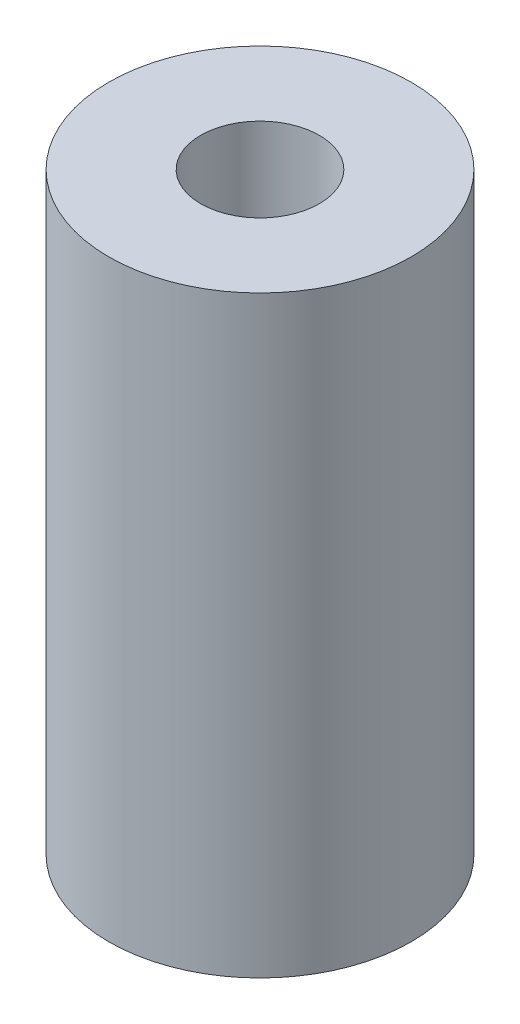
ISO-10303-21;
HEADER;
FILE_DESCRIPTION(('STEP AP214'),'2;1');
FILE_NAME('part.step','',(''),(''),'','','');
FILE_SCHEMA(('AUTOMOTIVE_DESIGN { 1 0 10303 214 1 1 1 1 }'));
ENDSEC;
DATA;
#1=APPLICATION_CONTEXT('core data for automotive mechanical design processes');
#2=APPLICATION_PROTOCOL_DEFINITION('international standard','automotive_design',2000,#1);
#3=PRODUCT_CONTEXT('',#1,'mechanical');
#4=PRODUCT('Part','Part','',(#3));
#5=PRODUCT_RELATED_PRODUCT_CATEGORY('part','',(#4));
#6=PRODUCT_DEFINITION_FORMATION('','',#4);
#7=PRODUCT_DEFINITION_CONTEXT('part definition',#1,'design');
#8=PRODUCT_DEFINITION('design','',#6,#7);
#9=PRODUCT_DEFINITION_SHAPE('','',#8);
#10=(LENGTH_UNIT() NAMED_UNIT(*) SI_UNIT(.MILLI.,.METRE.));
#11=(NAMED_UNIT(*) PLANE_ANGLE_UNIT() SI_UNIT($,.RADIAN.));
#12=(NAMED_UNIT(*) SI_UNIT($,.STERADIAN.) SOLID_ANGLE_UNIT());
#13=UNCERTAINTY_MEASURE_WITH_UNIT(LENGTH_MEASURE(1.E-05),#10,'distance_accuracy_value','');
#14=(GEOMETRIC_REPRESENTATION_CONTEXT(3) GLOBAL_UNCERTAINTY_ASSIGNED_CONTEXT((#13)) GLOBAL_UNIT_ASSIGNED_CONTEXT((#10,
#11,#12)) REPRESENTATION_CONTEXT('',''));
#15=CARTESIAN_POINT('',(0.,0.,0.));
#16=DIRECTION('',(0.,0.,1.));
#17=DIRECTION('',(1.,0.,0.));
#18=AXIS2_PLACEMENT_3D('',#15,#16,#17);
#19=CARTESIAN_POINT('',(0.,100.,0.));
#20=DIRECTION('',(0.,1.,0.));
#21=DIRECTION('',(0.,0.,1.));
#22=AXIS2_PLACEMENT_3D('',#19,#20,#21);
#23=PLANE('',#22);
#24=CARTESIAN_POINT('',(0.,100.,0.));
#25=DIRECTION('',(0.,1.,0.));
#26=DIRECTION('',(0.,0.,1.));
#27=AXIS2_PLACEMENT_3D('',#24,#25,#26);
#28=CIRCLE('',#27,25.5);
#29=CARTESIAN_POINT('',(0.,100.,25.5));
#30=VERTEX_POINT('',#29);
#31=EDGE_CURVE('E10',#30,#30,#28,.T.);
#32=ORIENTED_EDGE('',*,*,#31,.T.);
#33=EDGE_LOOP('',(#32));
#34=FACE_BOUND('',#33,.T.);
#35=CARTESIAN_POINT('',(0.,100.,0.));
#36=DIRECTION('',(0.,1.,0.));
#37=DIRECTION('',(0.,0.,1.));
#38=AXIS2_PLACEMENT_3D('',#35,#36,#37);
#39=CIRCLE('',#38,10.);
#40=CARTESIAN_POINT('',(0.,100.,10.));
#41=VERTEX_POINT('',#40);
#42=EDGE_CURVE('E42',#41,#41,#39,.T.);
#43=ORIENTED_EDGE('',*,*,#42,.F.);
#44=EDGE_LOOP('',(#43));
#45=FACE_BOUND('',#44,.T.);
#46=ADVANCED_FACE('F31',(#34,#45),#23,.T.);
#47=CARTESIAN_POINT('',(0.,0.,0.));
#48=DIRECTION('',(0.,1.,0.));
#49=DIRECTION('',(0.,0.,1.));
#50=AXIS2_PLACEMENT_3D('',#47,#48,#49);
#51=PLANE('',#50);
#52=CARTESIAN_POINT('',(0.,0.,0.));
#53=DIRECTION('',(0.,1.,0.));
#54=DIRECTION('',(0.,0.,1.));
#55=AXIS2_PLACEMENT_3D('',#52,#53,#54);
#56=CIRCLE('',#55,25.5);
#57=CARTESIAN_POINT('',(0.,0.,25.5));
#58=VERTEX_POINT('',#57);
#59=EDGE_CURVE('E35',#58,#58,#56,.T.);
#60=ORIENTED_EDGE('',*,*,#59,.F.);
#61=EDGE_LOOP('',(#60));
#62=FACE_BOUND('',#61,.T.);
#63=CARTESIAN_POINT('',(0.,0.,0.));
#64=DIRECTION('',(0.,1.,0.));
#65=DIRECTION('',(0.,0.,1.));
#66=AXIS2_PLACEMENT_3D('',#63,#64,#65);
#67=CIRCLE('',#66,10.);
#68=CARTESIAN_POINT('',(0.,0.,10.));
#69=VERTEX_POINT('',#68);
#70=EDGE_CURVE('E44',#69,#69,#67,.T.);
#71=ORIENTED_EDGE('',*,*,#70,.T.);
#72=EDGE_LOOP('',(#71));
#73=FACE_BOUND('',#72,.T.);
#74=ADVANCED_FACE('F54',(#62,#73),#51,.F.);
#75=CARTESIAN_POINT('',(0.,100.,0.));
#76=DIRECTION('',(0.,-1.,0.));
#77=DIRECTION('',(0.,0.,-1.));
#78=AXIS2_PLACEMENT_3D('',#75,#76,#77);
#79=CYLINDRICAL_SURFACE('',#78,25.5);
#80=ORIENTED_EDGE('',*,*,#31,.F.);
#81=EDGE_LOOP('',(#80));
#82=FACE_BOUND('',#81,.T.);
#83=ORIENTED_EDGE('',*,*,#59,.T.);
#84=EDGE_LOOP('',(#83));
#85=FACE_BOUND('',#84,.T.);
#86=ADVANCED_FACE('F33',(#82,#85),#79,.T.);
#87=CARTESIAN_POINT('',(0.,100.,0.));
#88=DIRECTION('',(0.,-1.,0.));
#89=DIRECTION('',(0.,0.,-1.));
#90=AXIS2_PLACEMENT_3D('',#87,#88,#89);
#91=CYLINDRICAL_SURFACE('',#90,10.);
#92=ORIENTED_EDGE('',*,*,#42,.T.);
#93=EDGE_LOOP('',(#92));
#94=FACE_BOUND('',#93,.T.);
#95=ORIENTED_EDGE('',*,*,#70,.F.);
#96=EDGE_LOOP('',(#95));
#97=FACE_BOUND('',#96,.T.);
#98=ADVANCED_FACE('F50',(#94,#97),#91,.F.);
#99=CLOSED_SHELL('',(#46,#74,#86,#98));
#100=MANIFOLD_SOLID_BREP('B2',#99);
#101=ADVANCED_BREP_SHAPE_REPRESENTATION('',(#18,#100),#14);
#102=SHAPE_DEFINITION_REPRESENTATION(#9,#101);
ENDSEC;
END-ISO-10303-21;
